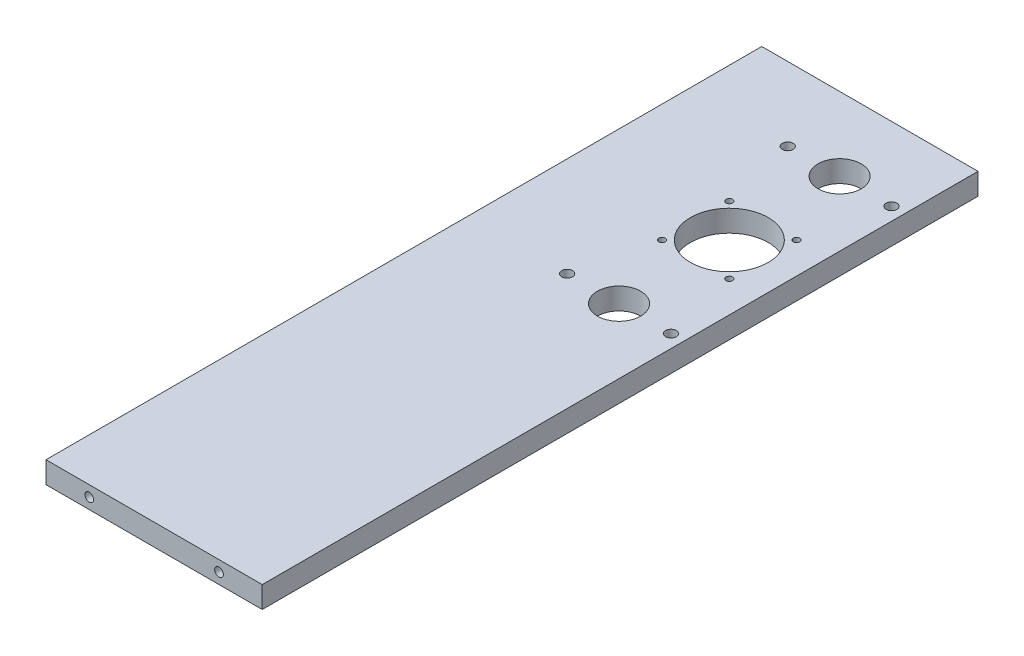
ISO-10303-21;
HEADER;
FILE_DESCRIPTION(('STEP AP214'),'2;1');
FILE_NAME('part.step','',(''),(''),'','','');
FILE_SCHEMA(('AUTOMOTIVE_DESIGN { 1 0 10303 214 1 1 1 1 }'));
ENDSEC;
DATA;
#1=APPLICATION_CONTEXT('core data for automotive mechanical design processes');
#2=APPLICATION_PROTOCOL_DEFINITION('international standard','automotive_design',2000,#1);
#3=PRODUCT_CONTEXT('',#1,'mechanical');
#4=PRODUCT('Part','Part','',(#3));
#5=PRODUCT_RELATED_PRODUCT_CATEGORY('part','',(#4));
#6=PRODUCT_DEFINITION_FORMATION('','',#4);
#7=PRODUCT_DEFINITION_CONTEXT('part definition',#1,'design');
#8=PRODUCT_DEFINITION('design','',#6,#7);
#9=PRODUCT_DEFINITION_SHAPE('','',#8);
#10=(LENGTH_UNIT() NAMED_UNIT(*) SI_UNIT(.MILLI.,.METRE.));
#11=(NAMED_UNIT(*) PLANE_ANGLE_UNIT() SI_UNIT($,.RADIAN.));
#12=(NAMED_UNIT(*) SI_UNIT($,.STERADIAN.) SOLID_ANGLE_UNIT());
#13=UNCERTAINTY_MEASURE_WITH_UNIT(LENGTH_MEASURE(1.E-05),#10,'distance_accuracy_value','');
#14=(GEOMETRIC_REPRESENTATION_CONTEXT(3) GLOBAL_UNCERTAINTY_ASSIGNED_CONTEXT((#13)) GLOBAL_UNIT_ASSIGNED_CONTEXT((#10,
#11,#12)) REPRESENTATION_CONTEXT('',''));
#15=CARTESIAN_POINT('',(0.,0.,0.));
#16=DIRECTION('',(0.,0.,1.));
#17=DIRECTION('',(1.,0.,0.));
#18=AXIS2_PLACEMENT_3D('',#15,#16,#17);
#19=CARTESIAN_POINT('',(-79.2239334984175,10.,-31.1640997523736));
#20=DIRECTION('',(0.,0.,1.));
#21=DIRECTION('',(1.,0.,0.));
#22=AXIS2_PLACEMENT_3D('',#19,#20,#21);
#23=PLANE('',#22);
#24=DIRECTION('',(-1.,0.,0.));
#25=VECTOR('',#24,1.);
#26=CARTESIAN_POINT('',(-79.2239334984175,0.,-31.1640997523736));
#27=LINE('',#26,#25);
#28=CARTESIAN_POINT('',(20.7760665015824,0.,-31.1640997523736));
#29=VERTEX_POINT('',#28);
#30=CARTESIAN_POINT('',(-79.2239334984175,0.,-31.1640997523736));
#31=VERTEX_POINT('',#30);
#32=EDGE_CURVE('E96',#29,#31,#27,.T.);
#33=ORIENTED_EDGE('',*,*,#32,.T.);
#34=DIRECTION('',(0.,-1.,0.));
#35=VECTOR('',#34,1.);
#36=CARTESIAN_POINT('',(-79.2239334984175,10.,-31.1640997523736));
#37=LINE('',#36,#35);
#38=CARTESIAN_POINT('',(-79.2239334984175,10.,-31.1640997523736));
#39=VERTEX_POINT('',#38);
#40=EDGE_CURVE('E11',#39,#31,#37,.T.);
#41=ORIENTED_EDGE('',*,*,#40,.F.);
#42=DIRECTION('',(-1.,0.,0.));
#43=VECTOR('',#42,1.);
#44=CARTESIAN_POINT('',(-79.2239334984175,10.,-31.1640997523736));
#45=LINE('',#44,#43);
#46=CARTESIAN_POINT('',(20.7760665015824,10.,-31.1640997523736));
#47=VERTEX_POINT('',#46);
#48=EDGE_CURVE('E84',#47,#39,#45,.T.);
#49=ORIENTED_EDGE('',*,*,#48,.F.);
#50=DIRECTION('',(0.,-1.,0.));
#51=VECTOR('',#50,1.);
#52=CARTESIAN_POINT('',(20.7760665015824,10.,-31.1640997523736));
#53=LINE('',#52,#51);
#54=EDGE_CURVE('E92',#47,#29,#53,.T.);
#55=ORIENTED_EDGE('',*,*,#54,.T.);
#56=EDGE_LOOP('',(#33,#41,#49,#55));
#57=FACE_BOUND('',#56,.T.);
#58=ADVANCED_FACE('F33',(#57),#23,.F.);
#59=CARTESIAN_POINT('',(-79.2239334984175,10.,299.835900247626));
#60=DIRECTION('',(1.,0.,0.));
#61=DIRECTION('',(0.,0.,-1.));
#62=AXIS2_PLACEMENT_3D('',#59,#60,#61);
#63=PLANE('',#62);
#64=DIRECTION('',(0.,0.,1.));
#65=VECTOR('',#64,1.);
#66=CARTESIAN_POINT('',(-79.2239334984175,0.,299.835900247626));
#67=LINE('',#66,#65);
#68=CARTESIAN_POINT('',(-79.2239334984175,0.,299.835900247626));
#69=VERTEX_POINT('',#68);
#70=EDGE_CURVE('E88',#31,#69,#67,.T.);
#71=ORIENTED_EDGE('',*,*,#70,.T.);
#72=DIRECTION('',(0.,-1.,0.));
#73=VECTOR('',#72,1.);
#74=CARTESIAN_POINT('',(-79.2239334984175,10.,299.835900247626));
#75=LINE('',#74,#73);
#76=CARTESIAN_POINT('',(-79.2239334984175,10.,299.835900247626));
#77=VERTEX_POINT('',#76);
#78=EDGE_CURVE('E41',#77,#69,#75,.T.);
#79=ORIENTED_EDGE('',*,*,#78,.F.);
#80=DIRECTION('',(0.,0.,1.));
#81=VECTOR('',#80,1.);
#82=CARTESIAN_POINT('',(-79.2239334984175,10.,299.835900247626));
#83=LINE('',#82,#81);
#84=EDGE_CURVE('E79',#39,#77,#83,.T.);
#85=ORIENTED_EDGE('',*,*,#84,.F.);
#86=ORIENTED_EDGE('',*,*,#40,.T.);
#87=EDGE_LOOP('',(#71,#79,#85,#86));
#88=FACE_BOUND('',#87,.T.);
#89=ADVANCED_FACE('F87',(#88),#63,.F.);
#90=CARTESIAN_POINT('',(20.7760665015825,10.,299.835900247626));
#91=DIRECTION('',(0.,0.,-1.));
#92=DIRECTION('',(-1.,0.,0.));
#93=AXIS2_PLACEMENT_3D('',#90,#91,#92);
#94=PLANE('',#93);
#95=CARTESIAN_POINT('',(0.776066501582462,5.,299.835900247626));
#96=DIRECTION('',(0.,0.,1.));
#97=DIRECTION('',(1.,0.,0.));
#98=AXIS2_PLACEMENT_3D('',#95,#96,#97);
#99=CIRCLE('',#98,2.);
#100=CARTESIAN_POINT('',(2.77606650158246,5.,299.835900247626));
#101=VERTEX_POINT('',#100);
#102=EDGE_CURVE('E182',#101,#101,#99,.T.);
#103=ORIENTED_EDGE('',*,*,#102,.F.);
#104=EDGE_LOOP('',(#103));
#105=FACE_BOUND('',#104,.T.);
#106=CARTESIAN_POINT('',(-59.2239334984175,5.,299.835900247626));
#107=DIRECTION('',(0.,0.,1.));
#108=DIRECTION('',(1.,0.,0.));
#109=AXIS2_PLACEMENT_3D('',#106,#107,#108);
#110=CIRCLE('',#109,2.);
#111=CARTESIAN_POINT('',(-57.2239334984175,5.,299.835900247626));
#112=VERTEX_POINT('',#111);
#113=EDGE_CURVE('E176',#112,#112,#110,.T.);
#114=ORIENTED_EDGE('',*,*,#113,.F.);
#115=EDGE_LOOP('',(#114));
#116=FACE_BOUND('',#115,.T.);
#117=DIRECTION('',(1.,0.,0.));
#118=VECTOR('',#117,1.);
#119=CARTESIAN_POINT('',(20.7760665015825,0.,299.835900247626));
#120=LINE('',#119,#118);
#121=CARTESIAN_POINT('',(20.7760665015825,0.,299.835900247626));
#122=VERTEX_POINT('',#121);
#123=EDGE_CURVE('E66',#69,#122,#120,.T.);
#124=ORIENTED_EDGE('',*,*,#123,.T.);
#125=DIRECTION('',(0.,-1.,0.));
#126=VECTOR('',#125,1.);
#127=CARTESIAN_POINT('',(20.7760665015825,10.,299.835900247626));
#128=LINE('',#127,#126);
#129=CARTESIAN_POINT('',(20.7760665015825,10.,299.835900247626));
#130=VERTEX_POINT('',#129);
#131=EDGE_CURVE('E89',#130,#122,#128,.T.);
#132=ORIENTED_EDGE('',*,*,#131,.F.);
#133=DIRECTION('',(1.,0.,0.));
#134=VECTOR('',#133,1.);
#135=CARTESIAN_POINT('',(20.7760665015825,10.,299.835900247626));
#136=LINE('',#135,#134);
#137=EDGE_CURVE('E82',#77,#130,#136,.T.);
#138=ORIENTED_EDGE('',*,*,#137,.F.);
#139=ORIENTED_EDGE('',*,*,#78,.T.);
#140=EDGE_LOOP('',(#124,#132,#138,#139));
#141=FACE_BOUND('',#140,.T.);
#142=ADVANCED_FACE('F90',(#105,#116,#141),#94,.F.);
#143=CARTESIAN_POINT('',(20.7760665015824,10.,-31.1640997523736));
#144=DIRECTION('',(-1.,0.,0.));
#145=DIRECTION('',(0.,0.,1.));
#146=AXIS2_PLACEMENT_3D('',#143,#144,#145);
#147=PLANE('',#146);
#148=DIRECTION('',(0.,0.,-1.));
#149=VECTOR('',#148,1.);
#150=CARTESIAN_POINT('',(20.7760665015824,0.,-31.1640997523736));
#151=LINE('',#150,#149);
#152=EDGE_CURVE('E72',#122,#29,#151,.T.);
#153=ORIENTED_EDGE('',*,*,#152,.T.);
#154=ORIENTED_EDGE('',*,*,#54,.F.);
#155=DIRECTION('',(0.,0.,-1.));
#156=VECTOR('',#155,1.);
#157=CARTESIAN_POINT('',(20.7760665015824,10.,-31.1640997523736));
#158=LINE('',#157,#156);
#159=EDGE_CURVE('E49',#130,#47,#158,.T.);
#160=ORIENTED_EDGE('',*,*,#159,.F.);
#161=ORIENTED_EDGE('',*,*,#131,.T.);
#162=EDGE_LOOP('',(#153,#154,#160,#161));
#163=FACE_BOUND('',#162,.T.);
#164=ADVANCED_FACE('F104',(#163),#147,.F.);
#165=CARTESIAN_POINT('',(0.,10.,0.));
#166=DIRECTION('',(0.,-1.,0.));
#167=DIRECTION('',(0.,0.,-1.));
#168=AXIS2_PLACEMENT_3D('',#165,#166,#167);
#169=PLANE('',#168);
#170=CARTESIAN_POINT('',(-24.7802826845216,10.,38.2795510615224));
#171=DIRECTION('',(0.,1.,0.));
#172=DIRECTION('',(0.,0.,1.));
#173=AXIS2_PLACEMENT_3D('',#170,#171,#172);
#174=CIRCLE('',#173,1.5);
#175=CARTESIAN_POINT('',(-24.7802826845216,10.,39.7795510615224));
#176=VERTEX_POINT('',#175);
#177=EDGE_CURVE('E170',#176,#176,#174,.T.);
#178=ORIENTED_EDGE('',*,*,#177,.F.);
#179=EDGE_LOOP('',(#178));
#180=FACE_BOUND('',#179,.T.);
#181=CARTESIAN_POINT('',(-24.7802826845216,10.,69.3922494337305));
#182=DIRECTION('',(0.,1.,0.));
#183=DIRECTION('',(0.,0.,1.));
#184=AXIS2_PLACEMENT_3D('',#181,#182,#183);
#185=CIRCLE('',#184,1.5);
#186=CARTESIAN_POINT('',(-24.7802826845216,10.,70.8922494337305));
#187=VERTEX_POINT('',#186);
#188=EDGE_CURVE('E164',#187,#187,#185,.T.);
#189=ORIENTED_EDGE('',*,*,#188,.F.);
#190=EDGE_LOOP('',(#189));
#191=FACE_BOUND('',#190,.T.);
#192=CARTESIAN_POINT('',(6.33241568768653,10.,69.3922494337305));
#193=DIRECTION('',(0.,1.,0.));
#194=DIRECTION('',(0.,0.,1.));
#195=AXIS2_PLACEMENT_3D('',#192,#193,#194);
#196=CIRCLE('',#195,1.5);
#197=CARTESIAN_POINT('',(6.33241568768653,10.,70.8922494337305));
#198=VERTEX_POINT('',#197);
#199=EDGE_CURVE('E158',#198,#198,#196,.T.);
#200=ORIENTED_EDGE('',*,*,#199,.F.);
#201=EDGE_LOOP('',(#200));
#202=FACE_BOUND('',#201,.T.);
#203=CARTESIAN_POINT('',(6.33241568768653,10.,38.2795510615224));
#204=DIRECTION('',(0.,1.,0.));
#205=DIRECTION('',(0.,0.,1.));
#206=AXIS2_PLACEMENT_3D('',#203,#204,#205);
#207=CIRCLE('',#206,1.5);
#208=CARTESIAN_POINT('',(6.33241568768653,10.,39.7795510615224));
#209=VERTEX_POINT('',#208);
#210=EDGE_CURVE('E152',#209,#209,#207,.T.);
#211=ORIENTED_EDGE('',*,*,#210,.F.);
#212=EDGE_LOOP('',(#211));
#213=FACE_BOUND('',#212,.T.);
#214=CARTESIAN_POINT('',(14.7760665015825,10.,104.835900247626));
#215=DIRECTION('',(0.,1.,0.));
#216=DIRECTION('',(0.,0.,1.));
#217=AXIS2_PLACEMENT_3D('',#214,#215,#216);
#218=CIRCLE('',#217,2.5);
#219=CARTESIAN_POINT('',(14.7760665015825,10.,107.335900247626));
#220=VERTEX_POINT('',#219);
#221=EDGE_CURVE('E146',#220,#220,#218,.T.);
#222=ORIENTED_EDGE('',*,*,#221,.F.);
#223=EDGE_LOOP('',(#222));
#224=FACE_BOUND('',#223,.T.);
#225=CARTESIAN_POINT('',(-33.2239334984175,10.,104.835900247626));
#226=DIRECTION('',(0.,1.,0.));
#227=DIRECTION('',(0.,0.,1.));
#228=AXIS2_PLACEMENT_3D('',#225,#226,#227);
#229=CIRCLE('',#228,2.5);
#230=CARTESIAN_POINT('',(-33.2239334984175,10.,107.335900247626));
#231=VERTEX_POINT('',#230);
#232=EDGE_CURVE('E140',#231,#231,#229,.T.);
#233=ORIENTED_EDGE('',*,*,#232,.F.);
#234=EDGE_LOOP('',(#233));
#235=FACE_BOUND('',#234,.T.);
#236=CARTESIAN_POINT('',(-9.22393349841752,10.,104.835900247626));
#237=DIRECTION('',(0.,1.,0.));
#238=DIRECTION('',(0.,0.,1.));
#239=AXIS2_PLACEMENT_3D('',#236,#237,#238);
#240=CIRCLE('',#239,10.);
#241=CARTESIAN_POINT('',(-9.22393349841752,10.,114.835900247626));
#242=VERTEX_POINT('',#241);
#243=EDGE_CURVE('E134',#242,#242,#240,.T.);
#244=ORIENTED_EDGE('',*,*,#243,.F.);
#245=EDGE_LOOP('',(#244));
#246=FACE_BOUND('',#245,.T.);
#247=CARTESIAN_POINT('',(-9.22393349841753,10.,53.8359002476264));
#248=DIRECTION('',(0.,1.,0.));
#249=DIRECTION('',(0.,0.,1.));
#250=AXIS2_PLACEMENT_3D('',#247,#248,#249);
#251=CIRCLE('',#250,18.);
#252=CARTESIAN_POINT('',(-9.22393349841753,10.,71.8359002476264));
#253=VERTEX_POINT('',#252);
#254=EDGE_CURVE('E128',#253,#253,#251,.T.);
#255=ORIENTED_EDGE('',*,*,#254,.F.);
#256=EDGE_LOOP('',(#255));
#257=FACE_BOUND('',#256,.T.);
#258=CARTESIAN_POINT('',(14.7760665015825,10.,2.83590024762642));
#259=DIRECTION('',(0.,1.,0.));
#260=DIRECTION('',(0.,0.,1.));
#261=AXIS2_PLACEMENT_3D('',#258,#259,#260);
#262=CIRCLE('',#261,2.5);
#263=CARTESIAN_POINT('',(14.7760665015825,10.,5.33590024762642));
#264=VERTEX_POINT('',#263);
#265=EDGE_CURVE('E122',#264,#264,#262,.T.);
#266=ORIENTED_EDGE('',*,*,#265,.F.);
#267=EDGE_LOOP('',(#266));
#268=FACE_BOUND('',#267,.T.);
#269=CARTESIAN_POINT('',(-33.2239334984175,10.,2.83590024762642));
#270=DIRECTION('',(0.,1.,0.));
#271=DIRECTION('',(0.,0.,1.));
#272=AXIS2_PLACEMENT_3D('',#269,#270,#271);
#273=CIRCLE('',#272,2.5);
#274=CARTESIAN_POINT('',(-33.2239334984175,10.,5.33590024762642));
#275=VERTEX_POINT('',#274);
#276=EDGE_CURVE('E116',#275,#275,#273,.T.);
#277=ORIENTED_EDGE('',*,*,#276,.F.);
#278=EDGE_LOOP('',(#277));
#279=FACE_BOUND('',#278,.T.);
#280=CARTESIAN_POINT('',(-9.22393349841753,10.,2.83590024762642));
#281=DIRECTION('',(0.,1.,0.));
#282=DIRECTION('',(0.,0.,1.));
#283=AXIS2_PLACEMENT_3D('',#280,#281,#282);
#284=CIRCLE('',#283,10.);
#285=CARTESIAN_POINT('',(-9.22393349841753,10.,12.8359002476264));
#286=VERTEX_POINT('',#285);
#287=EDGE_CURVE('E110',#286,#286,#284,.T.);
#288=ORIENTED_EDGE('',*,*,#287,.F.);
#289=EDGE_LOOP('',(#288));
#290=FACE_BOUND('',#289,.T.);
#291=ORIENTED_EDGE('',*,*,#48,.T.);
#292=ORIENTED_EDGE('',*,*,#84,.T.);
#293=ORIENTED_EDGE('',*,*,#137,.T.);
#294=ORIENTED_EDGE('',*,*,#159,.T.);
#295=EDGE_LOOP('',(#291,#292,#293,#294));
#296=FACE_BOUND('',#295,.T.);
#297=ADVANCED_FACE('F80',(#180,#191,#202,#213,#224,#235,#246,#257,#268,#279,#290,#296),#169,.F.);
#298=CARTESIAN_POINT('',(0.,0.,0.));
#299=DIRECTION('',(0.,-1.,0.));
#300=DIRECTION('',(0.,0.,-1.));
#301=AXIS2_PLACEMENT_3D('',#298,#299,#300);
#302=PLANE('',#301);
#303=CARTESIAN_POINT('',(-24.7802826845216,0.,38.2795510615224));
#304=DIRECTION('',(0.,1.,0.));
#305=DIRECTION('',(0.,0.,1.));
#306=AXIS2_PLACEMENT_3D('',#303,#304,#305);
#307=CIRCLE('',#306,1.5);
#308=CARTESIAN_POINT('',(-24.7802826845216,0.,39.7795510615224));
#309=VERTEX_POINT('',#308);
#310=EDGE_CURVE('E167',#309,#309,#307,.T.);
#311=ORIENTED_EDGE('',*,*,#310,.T.);
#312=EDGE_LOOP('',(#311));
#313=FACE_BOUND('',#312,.T.);
#314=CARTESIAN_POINT('',(-24.7802826845216,0.,69.3922494337305));
#315=DIRECTION('',(0.,1.,0.));
#316=DIRECTION('',(0.,0.,1.));
#317=AXIS2_PLACEMENT_3D('',#314,#315,#316);
#318=CIRCLE('',#317,1.5);
#319=CARTESIAN_POINT('',(-24.7802826845216,0.,70.8922494337305));
#320=VERTEX_POINT('',#319);
#321=EDGE_CURVE('E161',#320,#320,#318,.T.);
#322=ORIENTED_EDGE('',*,*,#321,.T.);
#323=EDGE_LOOP('',(#322));
#324=FACE_BOUND('',#323,.T.);
#325=CARTESIAN_POINT('',(6.33241568768653,0.,69.3922494337305));
#326=DIRECTION('',(0.,1.,0.));
#327=DIRECTION('',(0.,0.,1.));
#328=AXIS2_PLACEMENT_3D('',#325,#326,#327);
#329=CIRCLE('',#328,1.5);
#330=CARTESIAN_POINT('',(6.33241568768653,0.,70.8922494337305));
#331=VERTEX_POINT('',#330);
#332=EDGE_CURVE('E155',#331,#331,#329,.T.);
#333=ORIENTED_EDGE('',*,*,#332,.T.);
#334=EDGE_LOOP('',(#333));
#335=FACE_BOUND('',#334,.T.);
#336=CARTESIAN_POINT('',(6.33241568768653,0.,38.2795510615224));
#337=DIRECTION('',(0.,1.,0.));
#338=DIRECTION('',(0.,0.,1.));
#339=AXIS2_PLACEMENT_3D('',#336,#337,#338);
#340=CIRCLE('',#339,1.5);
#341=CARTESIAN_POINT('',(6.33241568768653,0.,39.7795510615224));
#342=VERTEX_POINT('',#341);
#343=EDGE_CURVE('E149',#342,#342,#340,.T.);
#344=ORIENTED_EDGE('',*,*,#343,.T.);
#345=EDGE_LOOP('',(#344));
#346=FACE_BOUND('',#345,.T.);
#347=CARTESIAN_POINT('',(14.7760665015825,0.,104.835900247626));
#348=DIRECTION('',(0.,1.,0.));
#349=DIRECTION('',(0.,0.,1.));
#350=AXIS2_PLACEMENT_3D('',#347,#348,#349);
#351=CIRCLE('',#350,2.5);
#352=CARTESIAN_POINT('',(14.7760665015825,0.,107.335900247626));
#353=VERTEX_POINT('',#352);
#354=EDGE_CURVE('E143',#353,#353,#351,.T.);
#355=ORIENTED_EDGE('',*,*,#354,.T.);
#356=EDGE_LOOP('',(#355));
#357=FACE_BOUND('',#356,.T.);
#358=CARTESIAN_POINT('',(-33.2239334984175,0.,104.835900247626));
#359=DIRECTION('',(0.,1.,0.));
#360=DIRECTION('',(0.,0.,1.));
#361=AXIS2_PLACEMENT_3D('',#358,#359,#360);
#362=CIRCLE('',#361,2.5);
#363=CARTESIAN_POINT('',(-33.2239334984175,0.,107.335900247626));
#364=VERTEX_POINT('',#363);
#365=EDGE_CURVE('E137',#364,#364,#362,.T.);
#366=ORIENTED_EDGE('',*,*,#365,.T.);
#367=EDGE_LOOP('',(#366));
#368=FACE_BOUND('',#367,.T.);
#369=CARTESIAN_POINT('',(-9.22393349841752,0.,104.835900247626));
#370=DIRECTION('',(0.,1.,0.));
#371=DIRECTION('',(0.,0.,1.));
#372=AXIS2_PLACEMENT_3D('',#369,#370,#371);
#373=CIRCLE('',#372,10.);
#374=CARTESIAN_POINT('',(-9.22393349841752,0.,114.835900247626));
#375=VERTEX_POINT('',#374);
#376=EDGE_CURVE('E131',#375,#375,#373,.T.);
#377=ORIENTED_EDGE('',*,*,#376,.T.);
#378=EDGE_LOOP('',(#377));
#379=FACE_BOUND('',#378,.T.);
#380=CARTESIAN_POINT('',(-9.22393349841753,0.,53.8359002476264));
#381=DIRECTION('',(0.,1.,0.));
#382=DIRECTION('',(0.,0.,1.));
#383=AXIS2_PLACEMENT_3D('',#380,#381,#382);
#384=CIRCLE('',#383,18.);
#385=CARTESIAN_POINT('',(-9.22393349841753,0.,71.8359002476264));
#386=VERTEX_POINT('',#385);
#387=EDGE_CURVE('E125',#386,#386,#384,.T.);
#388=ORIENTED_EDGE('',*,*,#387,.T.);
#389=EDGE_LOOP('',(#388));
#390=FACE_BOUND('',#389,.T.);
#391=CARTESIAN_POINT('',(14.7760665015825,0.,2.83590024762642));
#392=DIRECTION('',(0.,1.,0.));
#393=DIRECTION('',(0.,0.,1.));
#394=AXIS2_PLACEMENT_3D('',#391,#392,#393);
#395=CIRCLE('',#394,2.5);
#396=CARTESIAN_POINT('',(14.7760665015825,0.,5.33590024762642));
#397=VERTEX_POINT('',#396);
#398=EDGE_CURVE('E119',#397,#397,#395,.T.);
#399=ORIENTED_EDGE('',*,*,#398,.T.);
#400=EDGE_LOOP('',(#399));
#401=FACE_BOUND('',#400,.T.);
#402=CARTESIAN_POINT('',(-33.2239334984175,0.,2.83590024762642));
#403=DIRECTION('',(0.,1.,0.));
#404=DIRECTION('',(0.,0.,1.));
#405=AXIS2_PLACEMENT_3D('',#402,#403,#404);
#406=CIRCLE('',#405,2.5);
#407=CARTESIAN_POINT('',(-33.2239334984175,0.,5.33590024762642));
#408=VERTEX_POINT('',#407);
#409=EDGE_CURVE('E113',#408,#408,#406,.T.);
#410=ORIENTED_EDGE('',*,*,#409,.T.);
#411=EDGE_LOOP('',(#410));
#412=FACE_BOUND('',#411,.T.);
#413=CARTESIAN_POINT('',(-9.22393349841753,0.,2.83590024762642));
#414=DIRECTION('',(0.,1.,0.));
#415=DIRECTION('',(0.,0.,1.));
#416=AXIS2_PLACEMENT_3D('',#413,#414,#415);
#417=CIRCLE('',#416,10.);
#418=CARTESIAN_POINT('',(-9.22393349841753,0.,12.8359002476264));
#419=VERTEX_POINT('',#418);
#420=EDGE_CURVE('E99',#419,#419,#417,.T.);
#421=ORIENTED_EDGE('',*,*,#420,.T.);
#422=EDGE_LOOP('',(#421));
#423=FACE_BOUND('',#422,.T.);
#424=ORIENTED_EDGE('',*,*,#32,.F.);
#425=ORIENTED_EDGE('',*,*,#152,.F.);
#426=ORIENTED_EDGE('',*,*,#123,.F.);
#427=ORIENTED_EDGE('',*,*,#70,.F.);
#428=EDGE_LOOP('',(#424,#425,#426,#427));
#429=FACE_BOUND('',#428,.T.);
#430=ADVANCED_FACE('F107',(#313,#324,#335,#346,#357,#368,#379,#390,#401,#412,#423,#429),#302,.T.);
#431=CARTESIAN_POINT('',(-9.22393349841753,0.,2.83590024762642));
#432=DIRECTION('',(0.,1.,0.));
#433=DIRECTION('',(0.,0.,1.));
#434=AXIS2_PLACEMENT_3D('',#431,#432,#433);
#435=CYLINDRICAL_SURFACE('',#434,10.);
#436=ORIENTED_EDGE('',*,*,#420,.F.);
#437=EDGE_LOOP('',(#436));
#438=FACE_BOUND('',#437,.T.);
#439=ORIENTED_EDGE('',*,*,#287,.T.);
#440=EDGE_LOOP('',(#439));
#441=FACE_BOUND('',#440,.T.);
#442=ADVANCED_FACE('F228',(#438,#441),#435,.F.);
#443=CARTESIAN_POINT('',(-33.2239334984175,0.,2.83590024762642));
#444=DIRECTION('',(0.,1.,0.));
#445=DIRECTION('',(0.,0.,1.));
#446=AXIS2_PLACEMENT_3D('',#443,#444,#445);
#447=CYLINDRICAL_SURFACE('',#446,2.5);
#448=ORIENTED_EDGE('',*,*,#409,.F.);
#449=EDGE_LOOP('',(#448));
#450=FACE_BOUND('',#449,.T.);
#451=ORIENTED_EDGE('',*,*,#276,.T.);
#452=EDGE_LOOP('',(#451));
#453=FACE_BOUND('',#452,.T.);
#454=ADVANCED_FACE('F235',(#450,#453),#447,.F.);
#455=CARTESIAN_POINT('',(14.7760665015825,0.,2.83590024762642));
#456=DIRECTION('',(0.,1.,0.));
#457=DIRECTION('',(0.,0.,1.));
#458=AXIS2_PLACEMENT_3D('',#455,#456,#457);
#459=CYLINDRICAL_SURFACE('',#458,2.5);
#460=ORIENTED_EDGE('',*,*,#398,.F.);
#461=EDGE_LOOP('',(#460));
#462=FACE_BOUND('',#461,.T.);
#463=ORIENTED_EDGE('',*,*,#265,.T.);
#464=EDGE_LOOP('',(#463));
#465=FACE_BOUND('',#464,.T.);
#466=ADVANCED_FACE('F239',(#462,#465),#459,.F.);
#467=CARTESIAN_POINT('',(-9.22393349841753,0.,53.8359002476264));
#468=DIRECTION('',(0.,1.,0.));
#469=DIRECTION('',(0.,0.,1.));
#470=AXIS2_PLACEMENT_3D('',#467,#468,#469);
#471=CYLINDRICAL_SURFACE('',#470,18.);
#472=ORIENTED_EDGE('',*,*,#387,.F.);
#473=EDGE_LOOP('',(#472));
#474=FACE_BOUND('',#473,.T.);
#475=ORIENTED_EDGE('',*,*,#254,.T.);
#476=EDGE_LOOP('',(#475));
#477=FACE_BOUND('',#476,.T.);
#478=ADVANCED_FACE('F243',(#474,#477),#471,.F.);
#479=CARTESIAN_POINT('',(-9.22393349841752,0.,104.835900247626));
#480=DIRECTION('',(0.,1.,0.));
#481=DIRECTION('',(0.,0.,1.));
#482=AXIS2_PLACEMENT_3D('',#479,#480,#481);
#483=CYLINDRICAL_SURFACE('',#482,10.);
#484=ORIENTED_EDGE('',*,*,#376,.F.);
#485=EDGE_LOOP('',(#484));
#486=FACE_BOUND('',#485,.T.);
#487=ORIENTED_EDGE('',*,*,#243,.T.);
#488=EDGE_LOOP('',(#487));
#489=FACE_BOUND('',#488,.T.);
#490=ADVANCED_FACE('F247',(#486,#489),#483,.F.);
#491=CARTESIAN_POINT('',(-33.2239334984175,0.,104.835900247626));
#492=DIRECTION('',(0.,1.,0.));
#493=DIRECTION('',(0.,0.,1.));
#494=AXIS2_PLACEMENT_3D('',#491,#492,#493);
#495=CYLINDRICAL_SURFACE('',#494,2.5);
#496=ORIENTED_EDGE('',*,*,#365,.F.);
#497=EDGE_LOOP('',(#496));
#498=FACE_BOUND('',#497,.T.);
#499=ORIENTED_EDGE('',*,*,#232,.T.);
#500=EDGE_LOOP('',(#499));
#501=FACE_BOUND('',#500,.T.);
#502=ADVANCED_FACE('F251',(#498,#501),#495,.F.);
#503=CARTESIAN_POINT('',(14.7760665015825,0.,104.835900247626));
#504=DIRECTION('',(0.,1.,0.));
#505=DIRECTION('',(0.,0.,1.));
#506=AXIS2_PLACEMENT_3D('',#503,#504,#505);
#507=CYLINDRICAL_SURFACE('',#506,2.5);
#508=ORIENTED_EDGE('',*,*,#354,.F.);
#509=EDGE_LOOP('',(#508));
#510=FACE_BOUND('',#509,.T.);
#511=ORIENTED_EDGE('',*,*,#221,.T.);
#512=EDGE_LOOP('',(#511));
#513=FACE_BOUND('',#512,.T.);
#514=ADVANCED_FACE('F255',(#510,#513),#507,.F.);
#515=CARTESIAN_POINT('',(6.33241568768653,0.,38.2795510615224));
#516=DIRECTION('',(0.,1.,0.));
#517=DIRECTION('',(0.,0.,1.));
#518=AXIS2_PLACEMENT_3D('',#515,#516,#517);
#519=CYLINDRICAL_SURFACE('',#518,1.5);
#520=ORIENTED_EDGE('',*,*,#343,.F.);
#521=EDGE_LOOP('',(#520));
#522=FACE_BOUND('',#521,.T.);
#523=ORIENTED_EDGE('',*,*,#210,.T.);
#524=EDGE_LOOP('',(#523));
#525=FACE_BOUND('',#524,.T.);
#526=ADVANCED_FACE('F259',(#522,#525),#519,.F.);
#527=CARTESIAN_POINT('',(6.33241568768653,0.,69.3922494337305));
#528=DIRECTION('',(0.,1.,0.));
#529=DIRECTION('',(0.,0.,1.));
#530=AXIS2_PLACEMENT_3D('',#527,#528,#529);
#531=CYLINDRICAL_SURFACE('',#530,1.5);
#532=ORIENTED_EDGE('',*,*,#332,.F.);
#533=EDGE_LOOP('',(#532));
#534=FACE_BOUND('',#533,.T.);
#535=ORIENTED_EDGE('',*,*,#199,.T.);
#536=EDGE_LOOP('',(#535));
#537=FACE_BOUND('',#536,.T.);
#538=ADVANCED_FACE('F263',(#534,#537),#531,.F.);
#539=CARTESIAN_POINT('',(-24.7802826845216,0.,69.3922494337305));
#540=DIRECTION('',(0.,1.,0.));
#541=DIRECTION('',(0.,0.,1.));
#542=AXIS2_PLACEMENT_3D('',#539,#540,#541);
#543=CYLINDRICAL_SURFACE('',#542,1.5);
#544=ORIENTED_EDGE('',*,*,#321,.F.);
#545=EDGE_LOOP('',(#544));
#546=FACE_BOUND('',#545,.T.);
#547=ORIENTED_EDGE('',*,*,#188,.T.);
#548=EDGE_LOOP('',(#547));
#549=FACE_BOUND('',#548,.T.);
#550=ADVANCED_FACE('F213',(#546,#549),#543,.F.);
#551=CARTESIAN_POINT('',(-24.7802826845216,0.,38.2795510615224));
#552=DIRECTION('',(0.,1.,0.));
#553=DIRECTION('',(0.,0.,1.));
#554=AXIS2_PLACEMENT_3D('',#551,#552,#553);
#555=CYLINDRICAL_SURFACE('',#554,1.5);
#556=ORIENTED_EDGE('',*,*,#310,.F.);
#557=EDGE_LOOP('',(#556));
#558=FACE_BOUND('',#557,.T.);
#559=ORIENTED_EDGE('',*,*,#177,.T.);
#560=EDGE_LOOP('',(#559));
#561=FACE_BOUND('',#560,.T.);
#562=ADVANCED_FACE('F204',(#558,#561),#555,.F.);
#563=CARTESIAN_POINT('',(-59.2239334984175,5.,284.835900247626));
#564=DIRECTION('',(0.,0.,1.));
#565=DIRECTION('',(1.,0.,0.));
#566=AXIS2_PLACEMENT_3D('',#563,#564,#565);
#567=CYLINDRICAL_SURFACE('',#566,2.);
#568=CARTESIAN_POINT('',(-59.2239334984175,5.,284.835900247626));
#569=DIRECTION('',(0.,0.,1.));
#570=DIRECTION('',(1.,0.,0.));
#571=AXIS2_PLACEMENT_3D('',#568,#569,#570);
#572=CIRCLE('',#571,2.);
#573=CARTESIAN_POINT('',(-57.2239334984175,5.,284.835900247626));
#574=VERTEX_POINT('',#573);
#575=EDGE_CURVE('E173',#574,#574,#572,.T.);
#576=ORIENTED_EDGE('',*,*,#575,.F.);
#577=EDGE_LOOP('',(#576));
#578=FACE_BOUND('',#577,.T.);
#579=ORIENTED_EDGE('',*,*,#113,.T.);
#580=EDGE_LOOP('',(#579));
#581=FACE_BOUND('',#580,.T.);
#582=ADVANCED_FACE('F202',(#578,#581),#567,.F.);
#583=CARTESIAN_POINT('',(-59.2239334984175,5.,284.835900247626));
#584=DIRECTION('',(0.,0.,1.));
#585=DIRECTION('',(1.,0.,0.));
#586=AXIS2_PLACEMENT_3D('',#583,#584,#585);
#587=PLANE('',#586);
#588=ORIENTED_EDGE('',*,*,#575,.T.);
#589=EDGE_LOOP('',(#588));
#590=FACE_BOUND('',#589,.T.);
#591=ADVANCED_FACE('F193',(#590),#587,.T.);
#592=CARTESIAN_POINT('',(0.776066501582462,5.,284.835900247626));
#593=DIRECTION('',(0.,0.,1.));
#594=DIRECTION('',(1.,0.,0.));
#595=AXIS2_PLACEMENT_3D('',#592,#593,#594);
#596=CYLINDRICAL_SURFACE('',#595,2.);
#597=CARTESIAN_POINT('',(0.776066501582462,5.,284.835900247626));
#598=DIRECTION('',(0.,0.,1.));
#599=DIRECTION('',(1.,0.,0.));
#600=AXIS2_PLACEMENT_3D('',#597,#598,#599);
#601=CIRCLE('',#600,2.);
#602=CARTESIAN_POINT('',(2.77606650158246,5.,284.835900247626));
#603=VERTEX_POINT('',#602);
#604=EDGE_CURVE('E179',#603,#603,#601,.T.);
#605=ORIENTED_EDGE('',*,*,#604,.F.);
#606=EDGE_LOOP('',(#605));
#607=FACE_BOUND('',#606,.T.);
#608=ORIENTED_EDGE('',*,*,#102,.T.);
#609=EDGE_LOOP('',(#608));
#610=FACE_BOUND('',#609,.T.);
#611=ADVANCED_FACE('F190',(#607,#610),#596,.F.);
#612=CARTESIAN_POINT('',(0.776066501582462,5.,284.835900247626));
#613=DIRECTION('',(0.,0.,1.));
#614=DIRECTION('',(1.,0.,0.));
#615=AXIS2_PLACEMENT_3D('',#612,#613,#614);
#616=PLANE('',#615);
#617=ORIENTED_EDGE('',*,*,#604,.T.);
#618=EDGE_LOOP('',(#617));
#619=FACE_BOUND('',#618,.T.);
#620=ADVANCED_FACE('F188',(#619),#616,.T.);
#621=CLOSED_SHELL('',(#58,#89,#142,#164,#297,#430,#442,#454,#466,#478,#490,#502,#514,#526,#538,
#550,#562,#582,#591,#611,#620));
#622=MANIFOLD_SOLID_BREP('B2',#621);
#623=ADVANCED_BREP_SHAPE_REPRESENTATION('',(#18,#622),#14);
#624=SHAPE_DEFINITION_REPRESENTATION(#9,#623);
ENDSEC;
END-ISO-10303-21;
